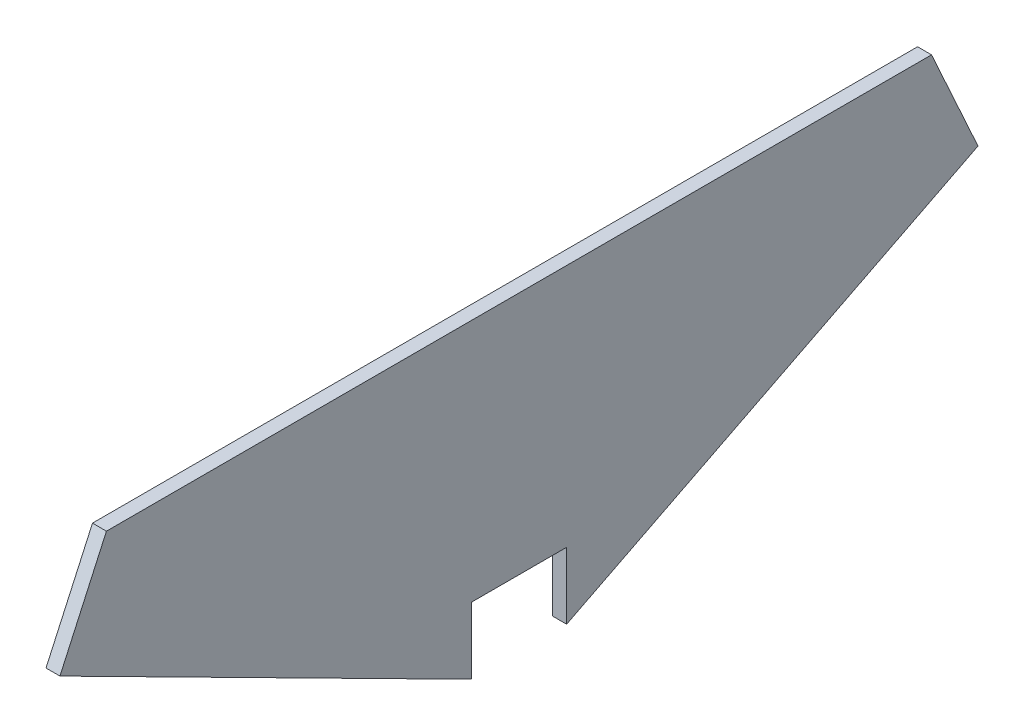
ISO-10303-21;
HEADER;
FILE_DESCRIPTION(('STEP AP214'),'2;1');
FILE_NAME('part.step','',(''),(''),'','','');
FILE_SCHEMA(('AUTOMOTIVE_DESIGN { 1 0 10303 214 1 1 1 1 }'));
ENDSEC;
DATA;
#1=APPLICATION_CONTEXT('core data for automotive mechanical design processes');
#2=APPLICATION_PROTOCOL_DEFINITION('international standard','automotive_design',2000,#1);
#3=PRODUCT_CONTEXT('',#1,'mechanical');
#4=PRODUCT('Part','Part','',(#3));
#5=PRODUCT_RELATED_PRODUCT_CATEGORY('part','',(#4));
#6=PRODUCT_DEFINITION_FORMATION('','',#4);
#7=PRODUCT_DEFINITION_CONTEXT('part definition',#1,'design');
#8=PRODUCT_DEFINITION('design','',#6,#7);
#9=PRODUCT_DEFINITION_SHAPE('','',#8);
#10=(LENGTH_UNIT() NAMED_UNIT(*) SI_UNIT(.MILLI.,.METRE.));
#11=(NAMED_UNIT(*) PLANE_ANGLE_UNIT() SI_UNIT($,.RADIAN.));
#12=(NAMED_UNIT(*) SI_UNIT($,.STERADIAN.) SOLID_ANGLE_UNIT());
#13=UNCERTAINTY_MEASURE_WITH_UNIT(LENGTH_MEASURE(1.E-05),#10,'distance_accuracy_value','');
#14=(GEOMETRIC_REPRESENTATION_CONTEXT(3) GLOBAL_UNCERTAINTY_ASSIGNED_CONTEXT((#13)) GLOBAL_UNIT_ASSIGNED_CONTEXT((#10,
#11,#12)) REPRESENTATION_CONTEXT('',''));
#15=CARTESIAN_POINT('',(0.,0.,0.));
#16=DIRECTION('',(0.,0.,1.));
#17=DIRECTION('',(1.,0.,0.));
#18=AXIS2_PLACEMENT_3D('',#15,#16,#17);
#19=CARTESIAN_POINT('',(6.,74.1104602945463,-173.446617491386));
#20=DIRECTION('',(0.,-0.413802944301184,0.910366477462604));
#21=DIRECTION('',(0.,-0.910366477462605,-0.413802944301185));
#22=AXIS2_PLACEMENT_3D('',#19,#20,#21);
#23=PLANE('',#22);
#24=DIRECTION('',(0.,0.910366477462605,0.413802944301185));
#25=VECTOR('',#24,1.);
#26=CARTESIAN_POINT('',(0.,74.1104602945463,-173.446617491386));
#27=LINE('',#26,#25);
#28=CARTESIAN_POINT('',(0.,30.1104602945463,-193.446617491386));
#29=VERTEX_POINT('',#28);
#30=CARTESIAN_POINT('',(0.,74.1104602945463,-173.446617491386));
#31=VERTEX_POINT('',#30);
#32=EDGE_CURVE('E129',#29,#31,#27,.T.);
#33=ORIENTED_EDGE('',*,*,#32,.T.);
#34=DIRECTION('',(-1.,0.,0.));
#35=VECTOR('',#34,1.);
#36=CARTESIAN_POINT('',(6.,74.1104602945463,-173.446617491386));
#37=LINE('',#36,#35);
#38=CARTESIAN_POINT('',(6.,74.1104602945463,-173.446617491386));
#39=VERTEX_POINT('',#38);
#40=EDGE_CURVE('E11',#39,#31,#37,.T.);
#41=ORIENTED_EDGE('',*,*,#40,.F.);
#42=DIRECTION('',(0.,0.910366477462605,0.413802944301185));
#43=VECTOR('',#42,1.);
#44=CARTESIAN_POINT('',(6.,74.1104602945463,-173.446617491386));
#45=LINE('',#44,#43);
#46=CARTESIAN_POINT('',(6.,30.1104602945463,-193.446617491386));
#47=VERTEX_POINT('',#46);
#48=EDGE_CURVE('E143',#47,#39,#45,.T.);
#49=ORIENTED_EDGE('',*,*,#48,.F.);
#50=DIRECTION('',(-1.,0.,0.));
#51=VECTOR('',#50,1.);
#52=CARTESIAN_POINT('',(6.,30.1104602945463,-193.446617491386));
#53=LINE('',#52,#51);
#54=EDGE_CURVE('E125',#47,#29,#53,.T.);
#55=ORIENTED_EDGE('',*,*,#54,.T.);
#56=EDGE_LOOP('',(#33,#41,#49,#55));
#57=FACE_BOUND('',#56,.T.);
#58=ADVANCED_FACE('F33',(#57),#23,.F.);
#59=CARTESIAN_POINT('',(6.,74.1104602945463,-173.446617491386));
#60=DIRECTION('',(0.,-1.,0.));
#61=DIRECTION('',(0.,0.,-1.));
#62=AXIS2_PLACEMENT_3D('',#59,#60,#61);
#63=PLANE('',#62);
#64=DIRECTION('',(0.,0.,1.));
#65=VECTOR('',#64,1.);
#66=CARTESIAN_POINT('',(0.,74.1104602945463,-173.446617491386));
#67=LINE('',#66,#65);
#68=CARTESIAN_POINT('',(0.,74.1104602945462,181.553382508614));
#69=VERTEX_POINT('',#68);
#70=EDGE_CURVE('E132',#31,#69,#67,.T.);
#71=ORIENTED_EDGE('',*,*,#70,.T.);
#72=DIRECTION('',(-1.,0.,0.));
#73=VECTOR('',#72,1.);
#74=CARTESIAN_POINT('',(6.,74.1104602945462,181.553382508614));
#75=LINE('',#74,#73);
#76=CARTESIAN_POINT('',(6.,74.1104602945462,181.553382508614));
#77=VERTEX_POINT('',#76);
#78=EDGE_CURVE('E41',#77,#69,#75,.T.);
#79=ORIENTED_EDGE('',*,*,#78,.F.);
#80=DIRECTION('',(0.,0.,1.));
#81=VECTOR('',#80,1.);
#82=CARTESIAN_POINT('',(6.,74.1104602945463,-173.446617491386));
#83=LINE('',#82,#81);
#84=EDGE_CURVE('E92',#39,#77,#83,.T.);
#85=ORIENTED_EDGE('',*,*,#84,.F.);
#86=ORIENTED_EDGE('',*,*,#40,.T.);
#87=EDGE_LOOP('',(#71,#79,#85,#86));
#88=FACE_BOUND('',#87,.T.);
#89=ADVANCED_FACE('F178',(#88),#63,.F.);
#90=CARTESIAN_POINT('',(6.,74.1104602945462,181.553382508614));
#91=DIRECTION('',(0.,-0.413802944301185,-0.910366477462604));
#92=DIRECTION('',(0.,0.910366477462604,-0.413802944301185));
#93=AXIS2_PLACEMENT_3D('',#90,#91,#92);
#94=PLANE('',#93);
#95=DIRECTION('',(0.,-0.910366477462604,0.413802944301185));
#96=VECTOR('',#95,1.);
#97=CARTESIAN_POINT('',(0.,74.1104602945462,181.553382508614));
#98=LINE('',#97,#96);
#99=CARTESIAN_POINT('',(0.,30.1104602945462,201.553382508614));
#100=VERTEX_POINT('',#99);
#101=EDGE_CURVE('E134',#69,#100,#98,.T.);
#102=ORIENTED_EDGE('',*,*,#101,.T.);
#103=DIRECTION('',(-1.,0.,0.));
#104=VECTOR('',#103,1.);
#105=CARTESIAN_POINT('',(6.,30.1104602945462,201.553382508614));
#106=LINE('',#105,#104);
#107=CARTESIAN_POINT('',(6.,30.1104602945462,201.553382508614));
#108=VERTEX_POINT('',#107);
#109=EDGE_CURVE('E150',#108,#100,#106,.T.);
#110=ORIENTED_EDGE('',*,*,#109,.F.);
#111=DIRECTION('',(0.,-0.910366477462604,0.413802944301185));
#112=VECTOR('',#111,1.);
#113=CARTESIAN_POINT('',(6.,74.1104602945462,181.553382508614));
#114=LINE('',#113,#112);
#115=EDGE_CURVE('E158',#77,#108,#114,.T.);
#116=ORIENTED_EDGE('',*,*,#115,.F.);
#117=ORIENTED_EDGE('',*,*,#78,.T.);
#118=EDGE_LOOP('',(#102,#110,#116,#117));
#119=FACE_BOUND('',#118,.T.);
#120=ADVANCED_FACE('F156',(#119),#94,.F.);
#121=CARTESIAN_POINT('',(6.,30.1104602945462,201.553382508614));
#122=DIRECTION('',(0.,0.892043028914365,-0.451950478000948));
#123=DIRECTION('',(0.,0.451950478000948,0.892043028914365));
#124=AXIS2_PLACEMENT_3D('',#121,#122,#123);
#125=PLANE('',#124);
#126=DIRECTION('',(0.,-0.451950478000948,-0.892043028914365));
#127=VECTOR('',#126,1.);
#128=CARTESIAN_POINT('',(0.,30.1104602945462,201.553382508614));
#129=LINE('',#128,#127);
#130=CARTESIAN_POINT('',(0.,-59.5659701165784,24.553382508614));
#131=VERTEX_POINT('',#130);
#132=EDGE_CURVE('E136',#100,#131,#129,.T.);
#133=ORIENTED_EDGE('',*,*,#132,.T.);
#134=DIRECTION('',(-1.,0.,0.));
#135=VECTOR('',#134,1.);
#136=CARTESIAN_POINT('',(6.,-59.5659701165784,24.553382508614));
#137=LINE('',#136,#135);
#138=CARTESIAN_POINT('',(6.,-59.5659701165784,24.553382508614));
#139=VERTEX_POINT('',#138);
#140=EDGE_CURVE('E147',#139,#131,#137,.T.);
#141=ORIENTED_EDGE('',*,*,#140,.F.);
#142=DIRECTION('',(0.,-0.451950478000948,-0.892043028914365));
#143=VECTOR('',#142,1.);
#144=CARTESIAN_POINT('',(6.,30.1104602945462,201.553382508614));
#145=LINE('',#144,#143);
#146=EDGE_CURVE('E170',#108,#139,#145,.T.);
#147=ORIENTED_EDGE('',*,*,#146,.F.);
#148=ORIENTED_EDGE('',*,*,#109,.T.);
#149=EDGE_LOOP('',(#133,#141,#147,#148));
#150=FACE_BOUND('',#149,.T.);
#151=ADVANCED_FACE('F166',(#150),#125,.F.);
#152=CARTESIAN_POINT('',(6.,-59.5659701165784,24.553382508614));
#153=DIRECTION('',(0.,0.,1.));
#154=DIRECTION('',(1.,0.,0.));
#155=AXIS2_PLACEMENT_3D('',#152,#153,#154);
#156=PLANE('',#155);
#157=DIRECTION('',(0.,1.,0.));
#158=VECTOR('',#157,1.);
#159=CARTESIAN_POINT('',(0.,-59.5659701165784,24.553382508614));
#160=LINE('',#159,#158);
#161=CARTESIAN_POINT('',(0.,-30.8895397054537,24.553382508614));
#162=VERTEX_POINT('',#161);
#163=EDGE_CURVE('E138',#131,#162,#160,.T.);
#164=ORIENTED_EDGE('',*,*,#163,.T.);
#165=DIRECTION('',(-1.,0.,0.));
#166=VECTOR('',#165,1.);
#167=CARTESIAN_POINT('',(6.,-30.8895397054537,24.553382508614));
#168=LINE('',#167,#166);
#169=CARTESIAN_POINT('',(6.,-30.8895397054537,24.553382508614));
#170=VERTEX_POINT('',#169);
#171=EDGE_CURVE('E120',#170,#162,#168,.T.);
#172=ORIENTED_EDGE('',*,*,#171,.F.);
#173=DIRECTION('',(0.,1.,0.));
#174=VECTOR('',#173,1.);
#175=CARTESIAN_POINT('',(6.,-59.5659701165784,24.553382508614));
#176=LINE('',#175,#174);
#177=EDGE_CURVE('E111',#139,#170,#176,.T.);
#178=ORIENTED_EDGE('',*,*,#177,.F.);
#179=ORIENTED_EDGE('',*,*,#140,.T.);
#180=EDGE_LOOP('',(#164,#172,#178,#179));
#181=FACE_BOUND('',#180,.T.);
#182=ADVANCED_FACE('F169',(#181),#156,.F.);
#183=CARTESIAN_POINT('',(6.,-30.8895397054537,24.553382508614));
#184=DIRECTION('',(0.,1.,0.));
#185=DIRECTION('',(0.,0.,1.));
#186=AXIS2_PLACEMENT_3D('',#183,#184,#185);
#187=PLANE('',#186);
#188=DIRECTION('',(0.,0.,-1.));
#189=VECTOR('',#188,1.);
#190=CARTESIAN_POINT('',(0.,-30.8895397054537,24.553382508614));
#191=LINE('',#190,#189);
#192=CARTESIAN_POINT('',(0.,-30.8895397054537,-16.446617491386));
#193=VERTEX_POINT('',#192);
#194=EDGE_CURVE('E119',#162,#193,#191,.T.);
#195=ORIENTED_EDGE('',*,*,#194,.T.);
#196=DIRECTION('',(-1.,0.,0.));
#197=VECTOR('',#196,1.);
#198=CARTESIAN_POINT('',(6.,-30.8895397054537,-16.446617491386));
#199=LINE('',#198,#197);
#200=CARTESIAN_POINT('',(6.,-30.8895397054537,-16.446617491386));
#201=VERTEX_POINT('',#200);
#202=EDGE_CURVE('E116',#201,#193,#199,.T.);
#203=ORIENTED_EDGE('',*,*,#202,.F.);
#204=DIRECTION('',(0.,0.,-1.));
#205=VECTOR('',#204,1.);
#206=CARTESIAN_POINT('',(6.,-30.8895397054537,24.553382508614));
#207=LINE('',#206,#205);
#208=EDGE_CURVE('E105',#170,#201,#207,.T.);
#209=ORIENTED_EDGE('',*,*,#208,.F.);
#210=ORIENTED_EDGE('',*,*,#171,.T.);
#211=EDGE_LOOP('',(#195,#203,#209,#210));
#212=FACE_BOUND('',#211,.T.);
#213=ADVANCED_FACE('F117',(#212),#187,.F.);
#214=CARTESIAN_POINT('',(6.,-59.5659701165784,-16.446617491386));
#215=DIRECTION('',(0.,0.,-1.));
#216=DIRECTION('',(0.,1.,0.));
#217=AXIS2_PLACEMENT_3D('',#214,#215,#216);
#218=PLANE('',#217);
#219=DIRECTION('',(0.,-1.,0.));
#220=VECTOR('',#219,1.);
#221=CARTESIAN_POINT('',(0.,-59.5659701165784,-16.446617491386));
#222=LINE('',#221,#220);
#223=CARTESIAN_POINT('',(0.,-59.5659701165784,-16.446617491386));
#224=VERTEX_POINT('',#223);
#225=EDGE_CURVE('E78',#193,#224,#222,.T.);
#226=ORIENTED_EDGE('',*,*,#225,.T.);
#227=DIRECTION('',(-1.,0.,0.));
#228=VECTOR('',#227,1.);
#229=CARTESIAN_POINT('',(6.,-59.5659701165784,-16.446617491386));
#230=LINE('',#229,#228);
#231=CARTESIAN_POINT('',(6.,-59.5659701165784,-16.446617491386));
#232=VERTEX_POINT('',#231);
#233=EDGE_CURVE('E121',#232,#224,#230,.T.);
#234=ORIENTED_EDGE('',*,*,#233,.F.);
#235=DIRECTION('',(0.,-1.,0.));
#236=VECTOR('',#235,1.);
#237=CARTESIAN_POINT('',(6.,-59.5659701165784,-16.446617491386));
#238=LINE('',#237,#236);
#239=EDGE_CURVE('E109',#201,#232,#238,.T.);
#240=ORIENTED_EDGE('',*,*,#239,.F.);
#241=ORIENTED_EDGE('',*,*,#202,.T.);
#242=EDGE_LOOP('',(#226,#234,#240,#241));
#243=FACE_BOUND('',#242,.T.);
#244=ADVANCED_FACE('F123',(#243),#218,.F.);
#245=CARTESIAN_POINT('',(6.,30.1104602945463,-193.446617491386));
#246=DIRECTION('',(0.,0.892043028914364,0.451950478000949));
#247=DIRECTION('',(0.,-0.451950478000949,0.892043028914365));
#248=AXIS2_PLACEMENT_3D('',#245,#246,#247);
#249=PLANE('',#248);
#250=DIRECTION('',(0.,0.451950478000949,-0.892043028914365));
#251=VECTOR('',#250,1.);
#252=CARTESIAN_POINT('',(0.,30.1104602945463,-193.446617491386));
#253=LINE('',#252,#251);
#254=EDGE_CURVE('E84',#224,#29,#253,.T.);
#255=ORIENTED_EDGE('',*,*,#254,.T.);
#256=ORIENTED_EDGE('',*,*,#54,.F.);
#257=DIRECTION('',(0.,0.451950478000949,-0.892043028914365));
#258=VECTOR('',#257,1.);
#259=CARTESIAN_POINT('',(6.,30.1104602945463,-193.446617491386));
#260=LINE('',#259,#258);
#261=EDGE_CURVE('E49',#232,#47,#260,.T.);
#262=ORIENTED_EDGE('',*,*,#261,.F.);
#263=ORIENTED_EDGE('',*,*,#233,.T.);
#264=EDGE_LOOP('',(#255,#256,#262,#263));
#265=FACE_BOUND('',#264,.T.);
#266=ADVANCED_FACE('F194',(#265),#249,.F.);
#267=CARTESIAN_POINT('',(6.,0.,0.));
#268=DIRECTION('',(-1.,0.,0.));
#269=DIRECTION('',(0.,0.,1.));
#270=AXIS2_PLACEMENT_3D('',#267,#268,#269);
#271=PLANE('',#270);
#272=ORIENTED_EDGE('',*,*,#48,.T.);
#273=ORIENTED_EDGE('',*,*,#84,.T.);
#274=ORIENTED_EDGE('',*,*,#115,.T.);
#275=ORIENTED_EDGE('',*,*,#146,.T.);
#276=ORIENTED_EDGE('',*,*,#177,.T.);
#277=ORIENTED_EDGE('',*,*,#208,.T.);
#278=ORIENTED_EDGE('',*,*,#239,.T.);
#279=ORIENTED_EDGE('',*,*,#261,.T.);
#280=EDGE_LOOP('',(#272,#273,#274,#275,#276,#277,#278,#279));
#281=FACE_BOUND('',#280,.T.);
#282=ADVANCED_FACE('F107',(#281),#271,.F.);
#283=CARTESIAN_POINT('',(0.,0.,0.));
#284=DIRECTION('',(-1.,0.,0.));
#285=DIRECTION('',(0.,0.,1.));
#286=AXIS2_PLACEMENT_3D('',#283,#284,#285);
#287=PLANE('',#286);
#288=ORIENTED_EDGE('',*,*,#32,.F.);
#289=ORIENTED_EDGE('',*,*,#254,.F.);
#290=ORIENTED_EDGE('',*,*,#225,.F.);
#291=ORIENTED_EDGE('',*,*,#194,.F.);
#292=ORIENTED_EDGE('',*,*,#163,.F.);
#293=ORIENTED_EDGE('',*,*,#132,.F.);
#294=ORIENTED_EDGE('',*,*,#101,.F.);
#295=ORIENTED_EDGE('',*,*,#70,.F.);
#296=EDGE_LOOP('',(#288,#289,#290,#291,#292,#293,#294,#295));
#297=FACE_BOUND('',#296,.T.);
#298=ADVANCED_FACE('F162',(#297),#287,.T.);
#299=CLOSED_SHELL('',(#58,#89,#120,#151,#182,#213,#244,#266,#282,#298));
#300=MANIFOLD_SOLID_BREP('B2',#299);
#301=ADVANCED_BREP_SHAPE_REPRESENTATION('',(#18,#300),#14);
#302=SHAPE_DEFINITION_REPRESENTATION(#9,#301);
ENDSEC;
END-ISO-10303-21;
